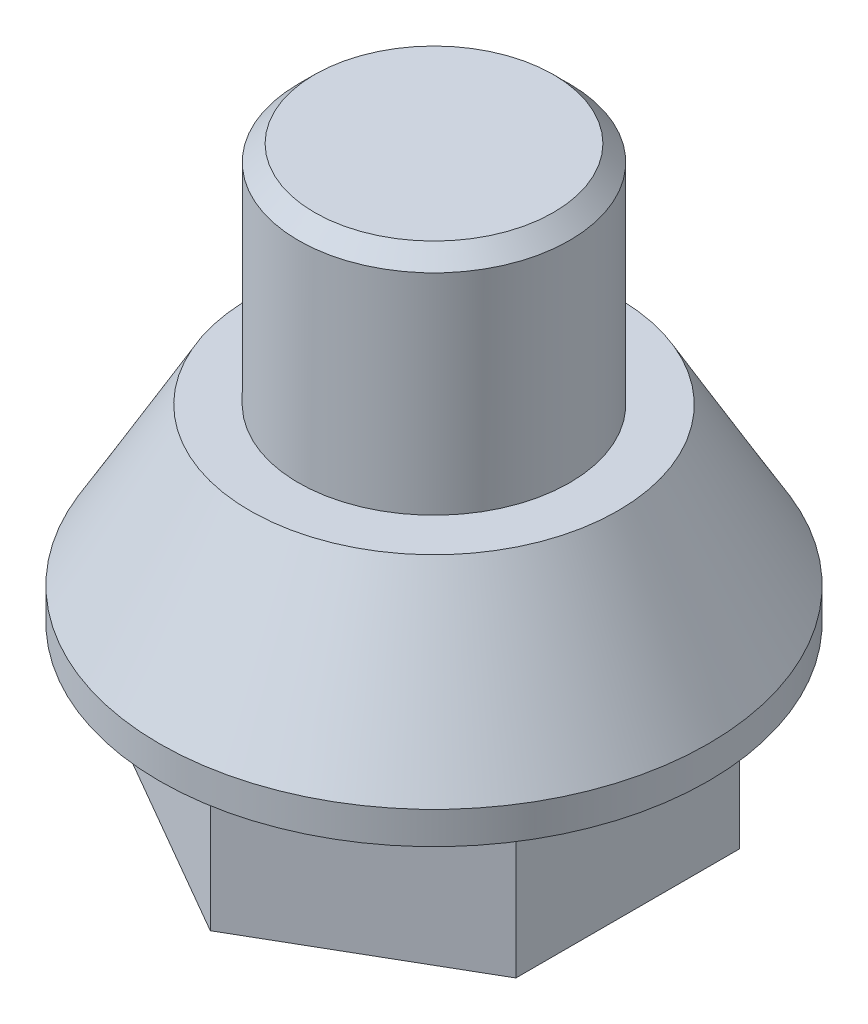
ISO-10303-21;
HEADER;
FILE_DESCRIPTION(('STEP AP214'),'2;1');
FILE_NAME('part.step','',(''),(''),'','','');
FILE_SCHEMA(('AUTOMOTIVE_DESIGN { 1 0 10303 214 1 1 1 1 }'));
ENDSEC;
DATA;
#1=APPLICATION_CONTEXT('core data for automotive mechanical design processes');
#2=APPLICATION_PROTOCOL_DEFINITION('international standard','automotive_design',2000,#1);
#3=PRODUCT_CONTEXT('',#1,'mechanical');
#4=PRODUCT('Part','Part','',(#3));
#5=PRODUCT_RELATED_PRODUCT_CATEGORY('part','',(#4));
#6=PRODUCT_DEFINITION_FORMATION('','',#4);
#7=PRODUCT_DEFINITION_CONTEXT('part definition',#1,'design');
#8=PRODUCT_DEFINITION('design','',#6,#7);
#9=PRODUCT_DEFINITION_SHAPE('','',#8);
#10=(LENGTH_UNIT() NAMED_UNIT(*) SI_UNIT(.MILLI.,.METRE.));
#11=(NAMED_UNIT(*) PLANE_ANGLE_UNIT() SI_UNIT($,.RADIAN.));
#12=(NAMED_UNIT(*) SI_UNIT($,.STERADIAN.) SOLID_ANGLE_UNIT());
#13=UNCERTAINTY_MEASURE_WITH_UNIT(LENGTH_MEASURE(1.E-05),#10,'distance_accuracy_value','');
#14=(GEOMETRIC_REPRESENTATION_CONTEXT(3) GLOBAL_UNCERTAINTY_ASSIGNED_CONTEXT((#13)) GLOBAL_UNIT_ASSIGNED_CONTEXT((#10,
#11,#12)) REPRESENTATION_CONTEXT('',''));
#15=CARTESIAN_POINT('',(0.,0.,0.));
#16=DIRECTION('',(0.,0.,1.));
#17=DIRECTION('',(1.,0.,0.));
#18=AXIS2_PLACEMENT_3D('',#15,#16,#17);
#19=CARTESIAN_POINT('',(-6.00000000000002,4.8,-3.46410161513769));
#20=DIRECTION('',(0.500000000000005,0.,0.866025403784436));
#21=DIRECTION('',(0.866025403784436,0.,-0.500000000000005));
#22=AXIS2_PLACEMENT_3D('',#19,#20,#21);
#23=PLANE('',#22);
#24=DIRECTION('',(-0.866025403784436,0.,0.500000000000005));
#25=VECTOR('',#24,1.);
#26=CARTESIAN_POINT('',(-6.00000000000002,0.,-3.46410161513769));
#27=LINE('',#26,#25);
#28=CARTESIAN_POINT('',(0.,0.,-6.9282032302755));
#29=VERTEX_POINT('',#28);
#30=CARTESIAN_POINT('',(-6.00000000000002,0.,-3.46410161513769));
#31=VERTEX_POINT('',#30);
#32=EDGE_CURVE('E147',#29,#31,#27,.T.);
#33=ORIENTED_EDGE('',*,*,#32,.T.);
#34=DIRECTION('',(0.,-1.,0.));
#35=VECTOR('',#34,1.);
#36=CARTESIAN_POINT('',(-6.00000000000002,4.8,-3.46410161513769));
#37=LINE('',#36,#35);
#38=CARTESIAN_POINT('',(-6.00000000000002,4.8,-3.46410161513769));
#39=VERTEX_POINT('',#38);
#40=EDGE_CURVE('E172',#39,#31,#37,.T.);
#41=ORIENTED_EDGE('',*,*,#40,.F.);
#42=DIRECTION('',(-0.866025403784436,0.,0.500000000000005));
#43=VECTOR('',#42,1.);
#44=CARTESIAN_POINT('',(-6.00000000000002,4.8,-3.46410161513769));
#45=LINE('',#44,#43);
#46=CARTESIAN_POINT('',(0.,4.8,-6.9282032302755));
#47=VERTEX_POINT('',#46);
#48=EDGE_CURVE('E137',#47,#39,#45,.T.);
#49=ORIENTED_EDGE('',*,*,#48,.F.);
#50=DIRECTION('',(0.,-1.,0.));
#51=VECTOR('',#50,1.);
#52=CARTESIAN_POINT('',(0.,4.8,-6.9282032302755));
#53=LINE('',#52,#51);
#54=EDGE_CURVE('E146',#47,#29,#53,.T.);
#55=ORIENTED_EDGE('',*,*,#54,.T.);
#56=EDGE_LOOP('',(#33,#41,#49,#55));
#57=FACE_BOUND('',#56,.T.);
#58=ADVANCED_FACE('F45',(#57),#23,.F.);
#59=CARTESIAN_POINT('',(-5.99999999999997,4.8,3.46410161513778));
#60=DIRECTION('',(1.,0.,0.));
#61=DIRECTION('',(0.,0.,-1.));
#62=AXIS2_PLACEMENT_3D('',#59,#60,#61);
#63=PLANE('',#62);
#64=DIRECTION('',(0.,0.,1.));
#65=VECTOR('',#64,1.);
#66=CARTESIAN_POINT('',(-5.99999999999997,0.,3.46410161513778));
#67=LINE('',#66,#65);
#68=CARTESIAN_POINT('',(-5.99999999999997,0.,3.46410161513778));
#69=VERTEX_POINT('',#68);
#70=EDGE_CURVE('E151',#31,#69,#67,.T.);
#71=ORIENTED_EDGE('',*,*,#70,.T.);
#72=DIRECTION('',(0.,-1.,0.));
#73=VECTOR('',#72,1.);
#74=CARTESIAN_POINT('',(-5.99999999999997,4.8,3.46410161513778));
#75=LINE('',#74,#73);
#76=CARTESIAN_POINT('',(-5.99999999999997,4.8,3.46410161513778));
#77=VERTEX_POINT('',#76);
#78=EDGE_CURVE('E120',#77,#69,#75,.T.);
#79=ORIENTED_EDGE('',*,*,#78,.F.);
#80=DIRECTION('',(0.,0.,1.));
#81=VECTOR('',#80,1.);
#82=CARTESIAN_POINT('',(-5.99999999999997,4.8,3.46410161513778));
#83=LINE('',#82,#81);
#84=EDGE_CURVE('E101',#39,#77,#83,.T.);
#85=ORIENTED_EDGE('',*,*,#84,.F.);
#86=ORIENTED_EDGE('',*,*,#40,.T.);
#87=EDGE_LOOP('',(#71,#79,#85,#86));
#88=FACE_BOUND('',#87,.T.);
#89=ADVANCED_FACE('F191',(#88),#63,.F.);
#90=CARTESIAN_POINT('',(0.,4.8,6.9282032302755));
#91=DIRECTION('',(0.499999999999997,0.,-0.86602540378444));
#92=DIRECTION('',(-0.86602540378444,0.,-0.499999999999997));
#93=AXIS2_PLACEMENT_3D('',#90,#91,#92);
#94=PLANE('',#93);
#95=DIRECTION('',(0.86602540378444,0.,0.499999999999997));
#96=VECTOR('',#95,1.);
#97=CARTESIAN_POINT('',(0.,0.,6.9282032302755));
#98=LINE('',#97,#96);
#99=CARTESIAN_POINT('',(0.,0.,6.9282032302755));
#100=VERTEX_POINT('',#99);
#101=EDGE_CURVE('E116',#69,#100,#98,.T.);
#102=ORIENTED_EDGE('',*,*,#101,.T.);
#103=DIRECTION('',(0.,-1.,0.));
#104=VECTOR('',#103,1.);
#105=CARTESIAN_POINT('',(0.,4.8,6.9282032302755));
#106=LINE('',#105,#104);
#107=CARTESIAN_POINT('',(0.,4.8,6.9282032302755));
#108=VERTEX_POINT('',#107);
#109=EDGE_CURVE('E109',#108,#100,#106,.T.);
#110=ORIENTED_EDGE('',*,*,#109,.F.);
#111=DIRECTION('',(0.86602540378444,0.,0.499999999999997));
#112=VECTOR('',#111,1.);
#113=CARTESIAN_POINT('',(0.,4.8,6.9282032302755));
#114=LINE('',#113,#112);
#115=EDGE_CURVE('E114',#77,#108,#114,.T.);
#116=ORIENTED_EDGE('',*,*,#115,.F.);
#117=ORIENTED_EDGE('',*,*,#78,.T.);
#118=EDGE_LOOP('',(#102,#110,#116,#117));
#119=FACE_BOUND('',#118,.T.);
#120=ADVANCED_FACE('F111',(#119),#94,.F.);
#121=CARTESIAN_POINT('',(6.00000000000003,4.8,3.46410161513769));
#122=DIRECTION('',(-0.500000000000005,0.,-0.866025403784436));
#123=DIRECTION('',(-0.866025403784436,0.,0.500000000000005));
#124=AXIS2_PLACEMENT_3D('',#121,#122,#123);
#125=PLANE('',#124);
#126=DIRECTION('',(0.866025403784436,0.,-0.500000000000005));
#127=VECTOR('',#126,1.);
#128=CARTESIAN_POINT('',(6.00000000000003,0.,3.46410161513769));
#129=LINE('',#128,#127);
#130=CARTESIAN_POINT('',(6.00000000000003,0.,3.46410161513769));
#131=VERTEX_POINT('',#130);
#132=EDGE_CURVE('E157',#100,#131,#129,.T.);
#133=ORIENTED_EDGE('',*,*,#132,.T.);
#134=DIRECTION('',(0.,-1.,0.));
#135=VECTOR('',#134,1.);
#136=CARTESIAN_POINT('',(6.00000000000003,4.8,3.46410161513769));
#137=LINE('',#136,#135);
#138=CARTESIAN_POINT('',(6.00000000000003,4.8,3.46410161513769));
#139=VERTEX_POINT('',#138);
#140=EDGE_CURVE('E121',#139,#131,#137,.T.);
#141=ORIENTED_EDGE('',*,*,#140,.F.);
#142=DIRECTION('',(0.866025403784436,0.,-0.500000000000005));
#143=VECTOR('',#142,1.);
#144=CARTESIAN_POINT('',(6.00000000000003,4.8,3.46410161513769));
#145=LINE('',#144,#143);
#146=EDGE_CURVE('E124',#108,#139,#145,.T.);
#147=ORIENTED_EDGE('',*,*,#146,.F.);
#148=ORIENTED_EDGE('',*,*,#109,.T.);
#149=EDGE_LOOP('',(#133,#141,#147,#148));
#150=FACE_BOUND('',#149,.T.);
#151=ADVANCED_FACE('F125',(#150),#125,.F.);
#152=CARTESIAN_POINT('',(5.99999999999997,4.8,-3.46410161513778));
#153=DIRECTION('',(-1.,0.,0.));
#154=DIRECTION('',(0.,0.,1.));
#155=AXIS2_PLACEMENT_3D('',#152,#153,#154);
#156=PLANE('',#155);
#157=DIRECTION('',(0.,0.,-1.));
#158=VECTOR('',#157,1.);
#159=CARTESIAN_POINT('',(5.99999999999997,0.,-3.46410161513778));
#160=LINE('',#159,#158);
#161=CARTESIAN_POINT('',(5.99999999999997,0.,-3.46410161513778));
#162=VERTEX_POINT('',#161);
#163=EDGE_CURVE('E86',#131,#162,#160,.T.);
#164=ORIENTED_EDGE('',*,*,#163,.T.);
#165=DIRECTION('',(0.,-1.,0.));
#166=VECTOR('',#165,1.);
#167=CARTESIAN_POINT('',(5.99999999999997,4.8,-3.46410161513778));
#168=LINE('',#167,#166);
#169=CARTESIAN_POINT('',(5.99999999999997,4.8,-3.46410161513778));
#170=VERTEX_POINT('',#169);
#171=EDGE_CURVE('E64',#170,#162,#168,.T.);
#172=ORIENTED_EDGE('',*,*,#171,.F.);
#173=DIRECTION('',(0.,0.,-1.));
#174=VECTOR('',#173,1.);
#175=CARTESIAN_POINT('',(5.99999999999997,4.8,-3.46410161513778));
#176=LINE('',#175,#174);
#177=EDGE_CURVE('E129',#139,#170,#176,.T.);
#178=ORIENTED_EDGE('',*,*,#177,.F.);
#179=ORIENTED_EDGE('',*,*,#140,.T.);
#180=EDGE_LOOP('',(#164,#172,#178,#179));
#181=FACE_BOUND('',#180,.T.);
#182=ADVANCED_FACE('F202',(#181),#156,.F.);
#183=CARTESIAN_POINT('',(0.,4.8,-6.9282032302755));
#184=DIRECTION('',(-0.499999999999997,0.,0.86602540378444));
#185=DIRECTION('',(0.86602540378444,0.,0.499999999999997));
#186=AXIS2_PLACEMENT_3D('',#183,#184,#185);
#187=PLANE('',#186);
#188=DIRECTION('',(-0.86602540378444,0.,-0.499999999999997));
#189=VECTOR('',#188,1.);
#190=CARTESIAN_POINT('',(0.,0.,-6.9282032302755));
#191=LINE('',#190,#189);
#192=EDGE_CURVE('E92',#162,#29,#191,.T.);
#193=ORIENTED_EDGE('',*,*,#192,.T.);
#194=ORIENTED_EDGE('',*,*,#54,.F.);
#195=DIRECTION('',(-0.86602540378444,0.,-0.499999999999997));
#196=VECTOR('',#195,1.);
#197=CARTESIAN_POINT('',(0.,4.8,-6.9282032302755));
#198=LINE('',#197,#196);
#199=EDGE_CURVE('E143',#170,#47,#198,.T.);
#200=ORIENTED_EDGE('',*,*,#199,.F.);
#201=ORIENTED_EDGE('',*,*,#171,.T.);
#202=EDGE_LOOP('',(#193,#194,#200,#201));
#203=FACE_BOUND('',#202,.T.);
#204=ADVANCED_FACE('F205',(#203),#187,.F.);
#205=CARTESIAN_POINT('',(0.,0.,0.));
#206=DIRECTION('',(0.,-1.,0.));
#207=DIRECTION('',(0.,0.,-1.));
#208=AXIS2_PLACEMENT_3D('',#205,#206,#207);
#209=PLANE('',#208);
#210=ORIENTED_EDGE('',*,*,#32,.F.);
#211=ORIENTED_EDGE('',*,*,#192,.F.);
#212=ORIENTED_EDGE('',*,*,#163,.F.);
#213=ORIENTED_EDGE('',*,*,#132,.F.);
#214=ORIENTED_EDGE('',*,*,#101,.F.);
#215=ORIENTED_EDGE('',*,*,#70,.F.);
#216=EDGE_LOOP('',(#210,#211,#212,#213,#214,#215));
#217=FACE_BOUND('',#216,.T.);
#218=ADVANCED_FACE('F208',(#217),#209,.T.);
#219=CARTESIAN_POINT('',(0.,4.8,0.));
#220=DIRECTION('',(0.,1.,0.));
#221=DIRECTION('',(0.,0.,1.));
#222=AXIS2_PLACEMENT_3D('',#219,#220,#221);
#223=PLANE('',#222);
#224=CARTESIAN_POINT('',(0.,4.8,0.));
#225=DIRECTION('',(0.,1.,0.));
#226=DIRECTION('',(0.,0.,1.));
#227=AXIS2_PLACEMENT_3D('',#224,#225,#226);
#228=CIRCLE('',#227,8.5);
#229=CARTESIAN_POINT('',(0.,4.8,8.5));
#230=VERTEX_POINT('',#229);
#231=EDGE_CURVE('E344',#230,#230,#228,.T.);
#232=ORIENTED_EDGE('',*,*,#231,.F.);
#233=EDGE_LOOP('',(#232));
#234=FACE_BOUND('',#233,.T.);
#235=ORIENTED_EDGE('',*,*,#199,.T.);
#236=ORIENTED_EDGE('',*,*,#48,.T.);
#237=ORIENTED_EDGE('',*,*,#84,.T.);
#238=ORIENTED_EDGE('',*,*,#115,.T.);
#239=ORIENTED_EDGE('',*,*,#146,.T.);
#240=ORIENTED_EDGE('',*,*,#177,.T.);
#241=EDGE_LOOP('',(#235,#236,#237,#238,#239,#240));
#242=FACE_BOUND('',#241,.T.);
#243=ADVANCED_FACE('F132',(#234,#242),#223,.F.);
#244=CARTESIAN_POINT('',(0.,5.8,0.));
#245=DIRECTION('',(0.,-1.,0.));
#246=DIRECTION('',(0.,0.,-1.));
#247=AXIS2_PLACEMENT_3D('',#244,#245,#246);
#248=CYLINDRICAL_SURFACE('',#247,8.5);
#249=CARTESIAN_POINT('',(0.,5.8,0.));
#250=DIRECTION('',(0.,1.,0.));
#251=DIRECTION('',(0.,0.,1.));
#252=AXIS2_PLACEMENT_3D('',#249,#250,#251);
#253=CIRCLE('',#252,8.5);
#254=CARTESIAN_POINT('',(0.,5.8,8.5));
#255=VERTEX_POINT('',#254);
#256=EDGE_CURVE('E152',#255,#255,#253,.T.);
#257=ORIENTED_EDGE('',*,*,#256,.F.);
#258=EDGE_LOOP('',(#257));
#259=FACE_BOUND('',#258,.T.);
#260=ORIENTED_EDGE('',*,*,#231,.T.);
#261=EDGE_LOOP('',(#260));
#262=FACE_BOUND('',#261,.T.);
#263=ADVANCED_FACE('F212',(#259,#262),#248,.T.);
#264=CARTESIAN_POINT('',(0.,5.8,0.));
#265=DIRECTION('',(0.,-1.,0.));
#266=DIRECTION('',(1.,0.,0.));
#267=AXIS2_PLACEMENT_3D('',#264,#265,#266);
#268=CONICAL_SURFACE('',#267,8.5,0.523598775598304);
#269=CARTESIAN_POINT('',(0.,10.6497422611928,0.));
#270=DIRECTION('',(0.,-1.,0.));
#271=DIRECTION('',(1.,0.,0.));
#272=AXIS2_PLACEMENT_3D('',#269,#270,#271);
#273=CIRCLE('',#272,5.7);
#274=CARTESIAN_POINT('',(5.7,10.6497422611928,0.));
#275=VERTEX_POINT('',#274);
#276=EDGE_CURVE('E342',#275,#275,#273,.T.);
#277=ORIENTED_EDGE('',*,*,#276,.T.);
#278=EDGE_LOOP('',(#277));
#279=FACE_BOUND('',#278,.T.);
#280=ORIENTED_EDGE('',*,*,#256,.T.);
#281=EDGE_LOOP('',(#280));
#282=FACE_BOUND('',#281,.T.);
#283=ADVANCED_FACE('F215',(#279,#282),#268,.T.);
#284=CARTESIAN_POINT('',(5.7,10.6497422611928,0.));
#285=DIRECTION('',(0.,1.,0.));
#286=DIRECTION('',(-1.,0.,0.));
#287=AXIS2_PLACEMENT_3D('',#284,#285,#286);
#288=PLANE('',#287);
#289=CARTESIAN_POINT('',(0.,10.6497422611928,0.));
#290=DIRECTION('',(0.,-1.,0.));
#291=DIRECTION('',(1.,0.,0.));
#292=AXIS2_PLACEMENT_3D('',#289,#290,#291);
#293=CIRCLE('',#292,4.2);
#294=CARTESIAN_POINT('',(4.2,10.6497422611928,0.));
#295=VERTEX_POINT('',#294);
#296=EDGE_CURVE('E339',#295,#295,#293,.T.);
#297=ORIENTED_EDGE('',*,*,#296,.T.);
#298=EDGE_LOOP('',(#297));
#299=FACE_BOUND('',#298,.T.);
#300=ORIENTED_EDGE('',*,*,#276,.F.);
#301=EDGE_LOOP('',(#300));
#302=FACE_BOUND('',#301,.T.);
#303=ADVANCED_FACE('F222',(#299,#302),#288,.T.);
#304=CARTESIAN_POINT('',(0.,5.8,0.));
#305=DIRECTION('',(0.,-1.,0.));
#306=DIRECTION('',(1.,0.,0.));
#307=AXIS2_PLACEMENT_3D('',#304,#305,#306);
#308=CYLINDRICAL_SURFACE('',#307,4.2);
#309=CARTESIAN_POINT('',(0.,17.1497422611928,0.));
#310=DIRECTION('',(0.,1.,0.));
#311=DIRECTION('',(-1.,0.,0.));
#312=AXIS2_PLACEMENT_3D('',#309,#310,#311);
#313=CIRCLE('',#312,4.2);
#314=CARTESIAN_POINT('',(-4.2,17.1497422611928,0.));
#315=VERTEX_POINT('',#314);
#316=EDGE_CURVE('E56',#315,#315,#313,.F.);
#317=ORIENTED_EDGE('',*,*,#316,.T.);
#318=EDGE_LOOP('',(#317));
#319=FACE_BOUND('',#318,.T.);
#320=ORIENTED_EDGE('',*,*,#296,.F.);
#321=EDGE_LOOP('',(#320));
#322=FACE_BOUND('',#321,.T.);
#323=ADVANCED_FACE('F178',(#319,#322),#308,.T.);
#324=CARTESIAN_POINT('',(4.2,17.6497422611928,0.));
#325=DIRECTION('',(0.,1.,0.));
#326=DIRECTION('',(-1.,0.,0.));
#327=AXIS2_PLACEMENT_3D('',#324,#325,#326);
#328=PLANE('',#327);
#329=CARTESIAN_POINT('',(0.,17.6497422611928,0.));
#330=DIRECTION('',(0.,1.,0.));
#331=DIRECTION('',(-1.,0.,0.));
#332=AXIS2_PLACEMENT_3D('',#329,#330,#331);
#333=CIRCLE('',#332,3.69999999999999);
#334=CARTESIAN_POINT('',(-3.69999999999999,17.6497422611928,0.));
#335=VERTEX_POINT('',#334);
#336=EDGE_CURVE('E11',#335,#335,#333,.T.);
#337=ORIENTED_EDGE('',*,*,#336,.T.);
#338=EDGE_LOOP('',(#337));
#339=FACE_BOUND('',#338,.T.);
#340=ADVANCED_FACE('F182',(#339),#328,.T.);
#341=CARTESIAN_POINT('',(0.,17.1497422611928,0.));
#342=DIRECTION('',(0.,-1.,0.));
#343=DIRECTION('',(1.,0.,0.));
#344=AXIS2_PLACEMENT_3D('',#341,#342,#343);
#345=CONICAL_SURFACE('',#344,4.2,0.785398163397453);
#346=ORIENTED_EDGE('',*,*,#336,.F.);
#347=EDGE_LOOP('',(#346));
#348=FACE_BOUND('',#347,.T.);
#349=ORIENTED_EDGE('',*,*,#316,.F.);
#350=EDGE_LOOP('',(#349));
#351=FACE_BOUND('',#350,.T.);
#352=ADVANCED_FACE('F48',(#348,#351),#345,.T.);
#353=CLOSED_SHELL('',(#58,#89,#120,#151,#182,#204,#218,#243,#263,#283,#303,#323,#340,#352));
#354=MANIFOLD_SOLID_BREP('B2',#353);
#355=ADVANCED_BREP_SHAPE_REPRESENTATION('',(#18,#354),#14);
#356=SHAPE_DEFINITION_REPRESENTATION(#9,#355);
ENDSEC;
END-ISO-10303-21;
